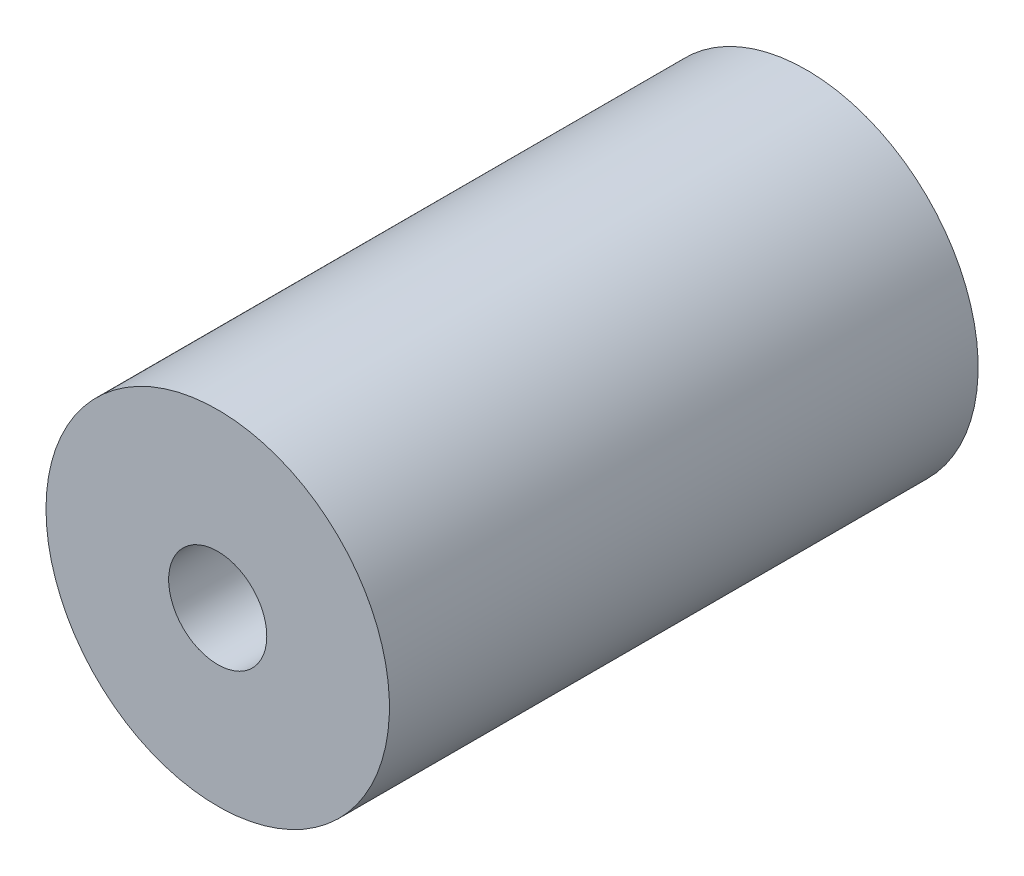
ISO-10303-21;
HEADER;
FILE_DESCRIPTION(('STEP AP214'),'2;1');
FILE_NAME('part.step','',(''),(''),'','','');
FILE_SCHEMA(('AUTOMOTIVE_DESIGN { 1 0 10303 214 1 1 1 1 }'));
ENDSEC;
DATA;
#1=APPLICATION_CONTEXT('core data for automotive mechanical design processes');
#2=APPLICATION_PROTOCOL_DEFINITION('international standard','automotive_design',2000,#1);
#3=PRODUCT_CONTEXT('',#1,'mechanical');
#4=PRODUCT('Part','Part','',(#3));
#5=PRODUCT_RELATED_PRODUCT_CATEGORY('part','',(#4));
#6=PRODUCT_DEFINITION_FORMATION('','',#4);
#7=PRODUCT_DEFINITION_CONTEXT('part definition',#1,'design');
#8=PRODUCT_DEFINITION('design','',#6,#7);
#9=PRODUCT_DEFINITION_SHAPE('','',#8);
#10=(LENGTH_UNIT() NAMED_UNIT(*) SI_UNIT(.MILLI.,.METRE.));
#11=(NAMED_UNIT(*) PLANE_ANGLE_UNIT() SI_UNIT($,.RADIAN.));
#12=(NAMED_UNIT(*) SI_UNIT($,.STERADIAN.) SOLID_ANGLE_UNIT());
#13=UNCERTAINTY_MEASURE_WITH_UNIT(LENGTH_MEASURE(1.E-05),#10,'distance_accuracy_value','');
#14=(GEOMETRIC_REPRESENTATION_CONTEXT(3) GLOBAL_UNCERTAINTY_ASSIGNED_CONTEXT((#13)) GLOBAL_UNIT_ASSIGNED_CONTEXT((#10,
#11,#12)) REPRESENTATION_CONTEXT('',''));
#15=CARTESIAN_POINT('',(0.,0.,0.));
#16=DIRECTION('',(0.,0.,1.));
#17=DIRECTION('',(1.,0.,0.));
#18=AXIS2_PLACEMENT_3D('',#15,#16,#17);
#19=CARTESIAN_POINT('',(0.,0.,15.24));
#20=DIRECTION('',(0.,0.,-1.));
#21=DIRECTION('',(-1.,0.,0.));
#22=AXIS2_PLACEMENT_3D('',#19,#20,#21);
#23=CYLINDRICAL_SURFACE('',#22,4.445);
#24=CARTESIAN_POINT('',(0.,0.,15.24));
#25=DIRECTION('',(0.,0.,1.));
#26=DIRECTION('',(1.,0.,0.));
#27=AXIS2_PLACEMENT_3D('',#24,#25,#26);
#28=CIRCLE('',#27,4.445);
#29=CARTESIAN_POINT('',(-4.445,0.,15.24));
#30=VERTEX_POINT('',#29);
#31=EDGE_CURVE('E10',#30,#30,#28,.T.);
#32=CARTESIAN_POINT('',(0.,0.,0.));
#33=DIRECTION('',(0.,0.,1.));
#34=DIRECTION('',(1.,0.,0.));
#35=AXIS2_PLACEMENT_3D('',#32,#33,#34);
#36=CIRCLE('',#35,4.445);
#37=CARTESIAN_POINT('',(-4.445,0.,0.));
#38=VERTEX_POINT('',#37);
#39=EDGE_CURVE('E34',#38,#38,#36,.T.);
#40=CARTESIAN_POINT('',(-4.445,0.,15.24));
#41=CARTESIAN_POINT('',(-4.445,0.,15.08125));
#42=CARTESIAN_POINT('',(-4.445,0.,14.9225));
#43=CARTESIAN_POINT('',(-4.445,0.,14.605));
#44=CARTESIAN_POINT('',(-4.445,0.,14.44625));
#45=CARTESIAN_POINT('',(-4.445,0.,14.12875));
#46=CARTESIAN_POINT('',(-4.445,0.,13.97));
#47=CARTESIAN_POINT('',(-4.445,0.,13.6525));
#48=CARTESIAN_POINT('',(-4.445,0.,13.49375));
#49=CARTESIAN_POINT('',(-4.445,0.,13.17625));
#50=CARTESIAN_POINT('',(-4.445,0.,13.0175));
#51=CARTESIAN_POINT('',(-4.445,0.,12.7));
#52=CARTESIAN_POINT('',(-4.445,0.,12.54125));
#53=CARTESIAN_POINT('',(-4.445,0.,12.22375));
#54=CARTESIAN_POINT('',(-4.445,0.,12.065));
#55=CARTESIAN_POINT('',(-4.445,0.,11.7475));
#56=CARTESIAN_POINT('',(-4.445,0.,11.58875));
#57=CARTESIAN_POINT('',(-4.445,0.,11.27125));
#58=CARTESIAN_POINT('',(-4.445,0.,11.1125));
#59=CARTESIAN_POINT('',(-4.445,0.,10.795));
#60=CARTESIAN_POINT('',(-4.445,0.,10.63625));
#61=CARTESIAN_POINT('',(-4.445,0.,10.31875));
#62=CARTESIAN_POINT('',(-4.445,0.,10.16));
#63=CARTESIAN_POINT('',(-4.445,0.,9.8425));
#64=CARTESIAN_POINT('',(-4.445,0.,9.68375));
#65=CARTESIAN_POINT('',(-4.445,0.,9.36625));
#66=CARTESIAN_POINT('',(-4.445,0.,9.2075));
#67=CARTESIAN_POINT('',(-4.445,0.,8.89));
#68=CARTESIAN_POINT('',(-4.445,0.,8.73125));
#69=CARTESIAN_POINT('',(-4.445,0.,8.41375));
#70=CARTESIAN_POINT('',(-4.445,0.,8.255));
#71=CARTESIAN_POINT('',(-4.445,0.,7.9375));
#72=CARTESIAN_POINT('',(-4.445,0.,7.77875));
#73=CARTESIAN_POINT('',(-4.445,0.,7.46125));
#74=CARTESIAN_POINT('',(-4.445,0.,7.3025));
#75=CARTESIAN_POINT('',(-4.445,0.,6.985));
#76=CARTESIAN_POINT('',(-4.445,0.,6.82625));
#77=CARTESIAN_POINT('',(-4.445,0.,6.50875));
#78=CARTESIAN_POINT('',(-4.445,0.,6.35));
#79=CARTESIAN_POINT('',(-4.445,0.,6.0325));
#80=CARTESIAN_POINT('',(-4.445,0.,5.87375));
#81=CARTESIAN_POINT('',(-4.445,0.,5.55625));
#82=CARTESIAN_POINT('',(-4.445,0.,5.3975));
#83=CARTESIAN_POINT('',(-4.445,0.,5.08));
#84=CARTESIAN_POINT('',(-4.445,0.,4.92125));
#85=CARTESIAN_POINT('',(-4.445,0.,4.60375));
#86=CARTESIAN_POINT('',(-4.445,0.,4.445));
#87=CARTESIAN_POINT('',(-4.445,0.,4.1275));
#88=CARTESIAN_POINT('',(-4.445,0.,3.96875));
#89=CARTESIAN_POINT('',(-4.445,0.,3.65125));
#90=CARTESIAN_POINT('',(-4.445,0.,3.4925));
#91=CARTESIAN_POINT('',(-4.445,0.,3.175));
#92=CARTESIAN_POINT('',(-4.445,0.,3.01625));
#93=CARTESIAN_POINT('',(-4.445,0.,2.69875));
#94=CARTESIAN_POINT('',(-4.445,0.,2.54));
#95=CARTESIAN_POINT('',(-4.445,0.,2.2225));
#96=CARTESIAN_POINT('',(-4.445,0.,2.06375));
#97=CARTESIAN_POINT('',(-4.445,0.,1.74625));
#98=CARTESIAN_POINT('',(-4.445,0.,1.5875));
#99=CARTESIAN_POINT('',(-4.445,0.,1.27));
#100=CARTESIAN_POINT('',(-4.445,0.,1.11125));
#101=CARTESIAN_POINT('',(-4.445,0.,0.79375));
#102=CARTESIAN_POINT('',(-4.445,0.,0.634999999999999));
#103=CARTESIAN_POINT('',(-4.445,0.,0.3175));
#104=CARTESIAN_POINT('',(-4.445,0.,0.15875));
#105=CARTESIAN_POINT('',(-4.445,0.,0.));
#106=B_SPLINE_CURVE_WITH_KNOTS('',3,(#40,#41,#42,#43,#44,#45,#46,#47,#48,#49,#50,#51,#52,#53,
#54,#55,#56,#57,#58,#59,#60,#61,#62,#63,#64,#65,#66,#67,#68,#69,#70,#71,#72,#73,#74,#75,#76,#77,
#78,#79,#80,#81,#82,#83,#84,#85,#86,#87,#88,#89,#90,#91,#92,#93,#94,#95,#96,#97,#98,#99,#100,
#101,#102,#103,#104,#105),.UNSPECIFIED.,.F.,.F.,(4,2,2,2,2,2,2,2,2,2,2,2,2,2,2,2,2,2,2,2,2,2,2,
2,2,2,2,2,2,2,2,2,4),(0.,0.476249999999999,0.952499999999998,1.42875,1.905,2.38125,2.8575,
3.33375,3.81,4.28625,4.7625,5.23875,5.715,6.19125,6.6675,7.14375,7.62,8.09625,8.5725,9.04875,
9.525,10.00125,10.4775,10.95375,11.43,11.90625,12.3825,12.85875,13.335,13.81125,14.2875,
14.76375,15.24),.UNSPECIFIED.);
#107=EDGE_CURVE('BSEAM31',#30,#38,#106,.T.);
#108=ORIENTED_EDGE('',*,*,#31,.F.);
#109=ORIENTED_EDGE('',*,*,#39,.T.);
#110=ORIENTED_EDGE('',*,*,#107,.T.);
#111=ORIENTED_EDGE('',*,*,#107,.F.);
#112=EDGE_LOOP('',(#108,#110,#109,#111));
#113=FACE_BOUND('',#112,.T.);
#114=ADVANCED_FACE('F31',(#113),#23,.T.);
#115=CARTESIAN_POINT('',(0.,0.,15.24));
#116=DIRECTION('',(0.,0.,1.));
#117=DIRECTION('',(1.,0.,0.));
#118=AXIS2_PLACEMENT_3D('',#115,#116,#117);
#119=PLANE('',#118);
#120=CARTESIAN_POINT('',(0.,0.,15.24));
#121=DIRECTION('',(0.,0.,1.));
#122=DIRECTION('',(1.,0.,0.));
#123=AXIS2_PLACEMENT_3D('',#120,#121,#122);
#124=CIRCLE('',#123,1.27);
#125=CARTESIAN_POINT('',(1.27,0.,15.24));
#126=VERTEX_POINT('',#125);
#127=EDGE_CURVE('E43',#126,#126,#124,.T.);
#128=ORIENTED_EDGE('',*,*,#127,.F.);
#129=EDGE_LOOP('',(#128));
#130=FACE_BOUND('',#129,.T.);
#131=ORIENTED_EDGE('',*,*,#31,.T.);
#132=EDGE_LOOP('',(#131));
#133=FACE_BOUND('',#132,.T.);
#134=ADVANCED_FACE('F58',(#130,#133),#119,.T.);
#135=CARTESIAN_POINT('',(0.,0.,0.));
#136=DIRECTION('',(0.,0.,1.));
#137=DIRECTION('',(1.,0.,0.));
#138=AXIS2_PLACEMENT_3D('',#135,#136,#137);
#139=PLANE('',#138);
#140=ORIENTED_EDGE('',*,*,#39,.F.);
#141=EDGE_LOOP('',(#140));
#142=FACE_BOUND('',#141,.T.);
#143=ADVANCED_FACE('F54',(#142),#139,.F.);
#144=CARTESIAN_POINT('',(0.,0.,12.7));
#145=DIRECTION('',(0.,0.,1.));
#146=DIRECTION('',(1.,0.,0.));
#147=AXIS2_PLACEMENT_3D('',#144,#145,#146);
#148=CYLINDRICAL_SURFACE('',#147,1.27);
#149=CARTESIAN_POINT('',(0.,0.,12.7));
#150=DIRECTION('',(0.,0.,1.));
#151=DIRECTION('',(1.,0.,0.));
#152=AXIS2_PLACEMENT_3D('',#149,#150,#151);
#153=CIRCLE('',#152,1.27);
#154=CARTESIAN_POINT('',(1.27,0.,12.7));
#155=VERTEX_POINT('',#154);
#156=EDGE_CURVE('E41',#155,#155,#153,.T.);
#157=ORIENTED_EDGE('',*,*,#156,.F.);
#158=EDGE_LOOP('',(#157));
#159=FACE_BOUND('',#158,.T.);
#160=ORIENTED_EDGE('',*,*,#127,.T.);
#161=EDGE_LOOP('',(#160));
#162=FACE_BOUND('',#161,.T.);
#163=ADVANCED_FACE('F51',(#159,#162),#148,.F.);
#164=CARTESIAN_POINT('',(0.,0.,12.7));
#165=DIRECTION('',(0.,0.,1.));
#166=DIRECTION('',(1.,0.,0.));
#167=AXIS2_PLACEMENT_3D('',#164,#165,#166);
#168=PLANE('',#167);
#169=ORIENTED_EDGE('',*,*,#156,.T.);
#170=EDGE_LOOP('',(#169));
#171=FACE_BOUND('',#170,.T.);
#172=ADVANCED_FACE('F49',(#171),#168,.T.);
#173=CLOSED_SHELL('',(#114,#134,#143,#163,#172));
#174=MANIFOLD_SOLID_BREP('B2',#173);
#175=ADVANCED_BREP_SHAPE_REPRESENTATION('',(#18,#174),#14);
#176=SHAPE_DEFINITION_REPRESENTATION(#9,#175);
ENDSEC;
END-ISO-10303-21;
